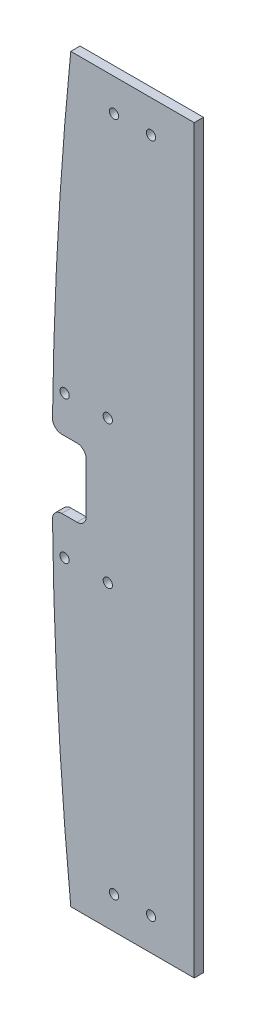
ISO-10303-21;
HEADER;
FILE_DESCRIPTION(('STEP AP214'),'2;1');
FILE_NAME('part.step','',(''),(''),'','','');
FILE_SCHEMA(('AUTOMOTIVE_DESIGN { 1 0 10303 214 1 1 1 1 }'));
ENDSEC;
DATA;
#1=APPLICATION_CONTEXT('core data for automotive mechanical design processes');
#2=APPLICATION_PROTOCOL_DEFINITION('international standard','automotive_design',2000,#1);
#3=PRODUCT_CONTEXT('',#1,'mechanical');
#4=PRODUCT('Part','Part','',(#3));
#5=PRODUCT_RELATED_PRODUCT_CATEGORY('part','',(#4));
#6=PRODUCT_DEFINITION_FORMATION('','',#4);
#7=PRODUCT_DEFINITION_CONTEXT('part definition',#1,'design');
#8=PRODUCT_DEFINITION('design','',#6,#7);
#9=PRODUCT_DEFINITION_SHAPE('','',#8);
#10=(LENGTH_UNIT() NAMED_UNIT(*) SI_UNIT(.MILLI.,.METRE.));
#11=(NAMED_UNIT(*) PLANE_ANGLE_UNIT() SI_UNIT($,.RADIAN.));
#12=(NAMED_UNIT(*) SI_UNIT($,.STERADIAN.) SOLID_ANGLE_UNIT());
#13=UNCERTAINTY_MEASURE_WITH_UNIT(LENGTH_MEASURE(1.E-05),#10,'distance_accuracy_value','');
#14=(GEOMETRIC_REPRESENTATION_CONTEXT(3) GLOBAL_UNCERTAINTY_ASSIGNED_CONTEXT((#13)) GLOBAL_UNIT_ASSIGNED_CONTEXT((#10,
#11,#12)) REPRESENTATION_CONTEXT('',''));
#15=CARTESIAN_POINT('',(0.,0.,0.));
#16=DIRECTION('',(0.,0.,1.));
#17=DIRECTION('',(1.,0.,0.));
#18=AXIS2_PLACEMENT_3D('',#15,#16,#17);
#19=CARTESIAN_POINT('',(3650.36632247804,1729.39124991335,3.));
#20=DIRECTION('',(0.,0.,1.));
#21=DIRECTION('',(1.,0.,0.));
#22=AXIS2_PLACEMENT_3D('',#19,#20,#21);
#23=PLANE('',#22);
#24=CARTESIAN_POINT('',(2451.36632247804,1706.29124991334,3.));
#25=DIRECTION('',(0.,0.,1.));
#26=DIRECTION('',(1.,0.,0.));
#27=AXIS2_PLACEMENT_3D('',#24,#25,#26);
#28=CIRCLE('',#27,1.50000000000006);
#29=CARTESIAN_POINT('',(2452.86632247804,1706.29124991334,3.));
#30=VERTEX_POINT('',#29);
#31=EDGE_CURVE('E307',#30,#30,#28,.T.);
#32=ORIENTED_EDGE('',*,*,#31,.F.);
#33=EDGE_LOOP('',(#32));
#34=FACE_BOUND('',#33,.T.);
#35=CARTESIAN_POINT('',(2465.36632247804,1752.49124991334,3.));
#36=DIRECTION('',(0.,0.,1.));
#37=DIRECTION('',(1.,0.,0.));
#38=AXIS2_PLACEMENT_3D('',#35,#36,#37);
#39=CIRCLE('',#38,1.50000000000006);
#40=CARTESIAN_POINT('',(2466.86632247804,1752.49124991334,3.));
#41=VERTEX_POINT('',#40);
#42=EDGE_CURVE('E319',#41,#41,#39,.T.);
#43=ORIENTED_EDGE('',*,*,#42,.F.);
#44=EDGE_LOOP('',(#43));
#45=FACE_BOUND('',#44,.T.);
#46=CARTESIAN_POINT('',(2467.36632247804,1838.89124991334,3.));
#47=DIRECTION('',(0.,0.,1.));
#48=DIRECTION('',(1.,0.,0.));
#49=AXIS2_PLACEMENT_3D('',#46,#47,#48);
#50=CIRCLE('',#49,1.50000000000006);
#51=CARTESIAN_POINT('',(2468.86632247804,1838.89124991334,3.));
#52=VERTEX_POINT('',#51);
#53=EDGE_CURVE('E331',#52,#52,#50,.T.);
#54=ORIENTED_EDGE('',*,*,#53,.F.);
#55=EDGE_LOOP('',(#54));
#56=FACE_BOUND('',#55,.T.);
#57=CARTESIAN_POINT('',(2479.36632247804,1619.89124991334,3.));
#58=DIRECTION('',(0.,0.,1.));
#59=DIRECTION('',(1.,0.,0.));
#60=AXIS2_PLACEMENT_3D('',#57,#58,#59);
#61=CIRCLE('',#60,1.50000000000006);
#62=CARTESIAN_POINT('',(2480.86632247804,1619.89124991334,3.));
#63=VERTEX_POINT('',#62);
#64=EDGE_CURVE('E157',#63,#63,#61,.T.);
#65=ORIENTED_EDGE('',*,*,#64,.F.);
#66=EDGE_LOOP('',(#65));
#67=FACE_BOUND('',#66,.T.);
#68=CARTESIAN_POINT('',(3650.36632247804,1729.39124991335,3.));
#69=DIRECTION('',(0.,0.,1.));
#70=DIRECTION('',(1.,0.,0.));
#71=AXIS2_PLACEMENT_3D('',#68,#69,#70);
#72=CIRCLE('',#71,1203.00000000001);
#73=CARTESIAN_POINT('',(2453.36632247804,1849.39124991338,3.));
#74=VERTEX_POINT('',#73);
#75=CARTESIAN_POINT('',(2447.44936993832,1743.52649991335,3.));
#76=VERTEX_POINT('',#75);
#77=EDGE_CURVE('E176',#74,#76,#72,.T.);
#78=ORIENTED_EDGE('',*,*,#77,.T.);
#79=CARTESIAN_POINT('',(2450.44916283742,1743.49124991334,3.));
#80=DIRECTION('',(0.,0.,1.));
#81=DIRECTION('',(1.,0.,0.));
#82=AXIS2_PLACEMENT_3D('',#79,#80,#81);
#83=CIRCLE('',#82,3.00000000000002);
#84=CARTESIAN_POINT('',(2450.44916283742,1740.49124991334,3.));
#85=VERTEX_POINT('',#84);
#86=EDGE_CURVE('E104',#76,#85,#83,.T.);
#87=ORIENTED_EDGE('',*,*,#86,.T.);
#88=DIRECTION('',(1.,0.,0.));
#89=VECTOR('',#88,1.);
#90=CARTESIAN_POINT('',(2455.36632247804,1740.49124991334,3.));
#91=LINE('',#90,#89);
#92=CARTESIAN_POINT('',(2455.36632247804,1740.49124991334,3.));
#93=VERTEX_POINT('',#92);
#94=EDGE_CURVE('E203',#85,#93,#91,.T.);
#95=ORIENTED_EDGE('',*,*,#94,.T.);
#96=CARTESIAN_POINT('',(2455.36632247804,1737.49124991334,3.));
#97=DIRECTION('',(0.,0.,-1.));
#98=DIRECTION('',(1.,0.,0.));
#99=AXIS2_PLACEMENT_3D('',#96,#97,#98);
#100=CIRCLE('',#99,2.99999999999978);
#101=CARTESIAN_POINT('',(2458.36632247804,1737.49124991334,3.));
#102=VERTEX_POINT('',#101);
#103=EDGE_CURVE('E222',#93,#102,#100,.T.);
#104=ORIENTED_EDGE('',*,*,#103,.T.);
#105=DIRECTION('',(0.,-1.,0.));
#106=VECTOR('',#105,1.);
#107=CARTESIAN_POINT('',(2458.36632247804,1721.29124991334,3.));
#108=LINE('',#107,#106);
#109=CARTESIAN_POINT('',(2458.36632247804,1721.29124991334,3.));
#110=VERTEX_POINT('',#109);
#111=EDGE_CURVE('E219',#102,#110,#108,.T.);
#112=ORIENTED_EDGE('',*,*,#111,.T.);
#113=CARTESIAN_POINT('',(2455.36632247804,1721.29124991334,3.));
#114=DIRECTION('',(0.,0.,-1.));
#115=DIRECTION('',(1.,0.,0.));
#116=AXIS2_PLACEMENT_3D('',#113,#114,#115);
#117=CIRCLE('',#116,2.99999999999989);
#118=CARTESIAN_POINT('',(2455.36632247804,1718.29124991334,3.));
#119=VERTEX_POINT('',#118);
#120=EDGE_CURVE('E221',#110,#119,#117,.T.);
#121=ORIENTED_EDGE('',*,*,#120,.T.);
#122=DIRECTION('',(-1.,0.,0.));
#123=VECTOR('',#122,1.);
#124=CARTESIAN_POINT('',(2455.36632247804,1718.29124991334,3.));
#125=LINE('',#124,#123);
#126=CARTESIAN_POINT('',(2450.44916283742,1718.29124991334,3.));
#127=VERTEX_POINT('',#126);
#128=EDGE_CURVE('E224',#119,#127,#125,.T.);
#129=ORIENTED_EDGE('',*,*,#128,.T.);
#130=CARTESIAN_POINT('',(2450.44916283742,1715.29124991334,3.));
#131=DIRECTION('',(0.,0.,1.));
#132=DIRECTION('',(1.,0.,0.));
#133=AXIS2_PLACEMENT_3D('',#130,#131,#132);
#134=CIRCLE('',#133,2.99999999999991);
#135=CARTESIAN_POINT('',(2447.44936993832,1715.25599991335,3.));
#136=VERTEX_POINT('',#135);
#137=EDGE_CURVE('E230',#127,#136,#134,.T.);
#138=ORIENTED_EDGE('',*,*,#137,.T.);
#139=CARTESIAN_POINT('',(3650.36632247804,1729.39124991335,3.));
#140=DIRECTION('',(0.,0.,1.));
#141=DIRECTION('',(1.,0.,0.));
#142=AXIS2_PLACEMENT_3D('',#139,#140,#141);
#143=CIRCLE('',#142,1203.00000000001);
#144=CARTESIAN_POINT('',(2453.36632247804,1609.39124991331,3.));
#145=VERTEX_POINT('',#144);
#146=EDGE_CURVE('E135',#136,#145,#143,.T.);
#147=ORIENTED_EDGE('',*,*,#146,.T.);
#148=DIRECTION('',(1.,7.88258347483922E-13,0.));
#149=VECTOR('',#148,1.);
#150=CARTESIAN_POINT('',(2453.36632247804,1609.39124991331,3.));
#151=LINE('',#150,#149);
#152=CARTESIAN_POINT('',(2493.36632247804,1609.39124991334,3.));
#153=VERTEX_POINT('',#152);
#154=EDGE_CURVE('E129',#145,#153,#151,.T.);
#155=ORIENTED_EDGE('',*,*,#154,.T.);
#156=DIRECTION('',(0.,1.,0.));
#157=VECTOR('',#156,1.);
#158=CARTESIAN_POINT('',(2493.36632247804,1849.39124991334,3.));
#159=LINE('',#158,#157);
#160=CARTESIAN_POINT('',(2493.36632247804,1849.39124991334,3.));
#161=VERTEX_POINT('',#160);
#162=EDGE_CURVE('E133',#153,#161,#159,.T.);
#163=ORIENTED_EDGE('',*,*,#162,.T.);
#164=DIRECTION('',(-1.,8.32667268468931E-13,0.));
#165=VECTOR('',#164,1.);
#166=CARTESIAN_POINT('',(2453.36632247804,1849.39124991338,3.));
#167=LINE('',#166,#165);
#168=EDGE_CURVE('E49',#161,#74,#167,.T.);
#169=ORIENTED_EDGE('',*,*,#168,.T.);
#170=EDGE_LOOP('',(#78,#87,#95,#104,#112,#121,#129,#138,#147,#155,#163,#169));
#171=FACE_BOUND('',#170,.T.);
#172=CARTESIAN_POINT('',(2467.36632247804,1619.89124991334,3.));
#173=DIRECTION('',(0.,0.,1.));
#174=DIRECTION('',(1.,0.,0.));
#175=AXIS2_PLACEMENT_3D('',#172,#173,#174);
#176=CIRCLE('',#175,1.50000000000006);
#177=CARTESIAN_POINT('',(2468.86632247804,1619.89124991334,3.));
#178=VERTEX_POINT('',#177);
#179=EDGE_CURVE('E337',#178,#178,#176,.T.);
#180=ORIENTED_EDGE('',*,*,#179,.F.);
#181=EDGE_LOOP('',(#180));
#182=FACE_BOUND('',#181,.T.);
#183=CARTESIAN_POINT('',(2479.36632247804,1838.89124991334,3.));
#184=DIRECTION('',(0.,0.,1.));
#185=DIRECTION('',(1.,0.,0.));
#186=AXIS2_PLACEMENT_3D('',#183,#184,#185);
#187=CIRCLE('',#186,1.50000000000006);
#188=CARTESIAN_POINT('',(2480.86632247804,1838.89124991334,3.));
#189=VERTEX_POINT('',#188);
#190=EDGE_CURVE('E325',#189,#189,#187,.T.);
#191=ORIENTED_EDGE('',*,*,#190,.F.);
#192=EDGE_LOOP('',(#191));
#193=FACE_BOUND('',#192,.T.);
#194=CARTESIAN_POINT('',(2465.36632247804,1706.29124991334,3.));
#195=DIRECTION('',(0.,0.,1.));
#196=DIRECTION('',(1.,0.,0.));
#197=AXIS2_PLACEMENT_3D('',#194,#195,#196);
#198=CIRCLE('',#197,1.50000000000006);
#199=CARTESIAN_POINT('',(2466.86632247804,1706.29124991334,3.));
#200=VERTEX_POINT('',#199);
#201=EDGE_CURVE('E313',#200,#200,#198,.T.);
#202=ORIENTED_EDGE('',*,*,#201,.F.);
#203=EDGE_LOOP('',(#202));
#204=FACE_BOUND('',#203,.T.);
#205=CARTESIAN_POINT('',(2451.36632247804,1752.49124991334,3.));
#206=DIRECTION('',(0.,0.,1.));
#207=DIRECTION('',(1.,0.,0.));
#208=AXIS2_PLACEMENT_3D('',#205,#206,#207);
#209=CIRCLE('',#208,1.50000000000006);
#210=CARTESIAN_POINT('',(2452.86632247804,1752.49124991334,3.));
#211=VERTEX_POINT('',#210);
#212=EDGE_CURVE('E298',#211,#211,#209,.T.);
#213=ORIENTED_EDGE('',*,*,#212,.F.);
#214=EDGE_LOOP('',(#213));
#215=FACE_BOUND('',#214,.T.);
#216=ADVANCED_FACE('F32',(#34,#45,#56,#67,#171,#182,#193,#204,#215),#23,.T.);
#217=CARTESIAN_POINT('',(3650.36632247804,1729.39124991335,0.));
#218=DIRECTION('',(0.,0.,1.));
#219=DIRECTION('',(1.,0.,0.));
#220=AXIS2_PLACEMENT_3D('',#217,#218,#219);
#221=PLANE('',#220);
#222=CARTESIAN_POINT('',(2451.36632247804,1706.29124991334,0.));
#223=DIRECTION('',(0.,0.,1.));
#224=DIRECTION('',(1.,0.,0.));
#225=AXIS2_PLACEMENT_3D('',#222,#223,#224);
#226=CIRCLE('',#225,1.50000000000006);
#227=CARTESIAN_POINT('',(2452.86632247804,1706.29124991334,0.));
#228=VERTEX_POINT('',#227);
#229=EDGE_CURVE('E304',#228,#228,#226,.T.);
#230=ORIENTED_EDGE('',*,*,#229,.T.);
#231=EDGE_LOOP('',(#230));
#232=FACE_BOUND('',#231,.T.);
#233=CARTESIAN_POINT('',(2465.36632247804,1752.49124991334,0.));
#234=DIRECTION('',(0.,0.,1.));
#235=DIRECTION('',(1.,0.,0.));
#236=AXIS2_PLACEMENT_3D('',#233,#234,#235);
#237=CIRCLE('',#236,1.50000000000006);
#238=CARTESIAN_POINT('',(2466.86632247804,1752.49124991334,0.));
#239=VERTEX_POINT('',#238);
#240=EDGE_CURVE('E316',#239,#239,#237,.T.);
#241=ORIENTED_EDGE('',*,*,#240,.T.);
#242=EDGE_LOOP('',(#241));
#243=FACE_BOUND('',#242,.T.);
#244=CARTESIAN_POINT('',(2467.36632247804,1838.89124991334,0.));
#245=DIRECTION('',(0.,0.,1.));
#246=DIRECTION('',(1.,0.,0.));
#247=AXIS2_PLACEMENT_3D('',#244,#245,#246);
#248=CIRCLE('',#247,1.50000000000006);
#249=CARTESIAN_POINT('',(2468.86632247804,1838.89124991334,0.));
#250=VERTEX_POINT('',#249);
#251=EDGE_CURVE('E328',#250,#250,#248,.T.);
#252=ORIENTED_EDGE('',*,*,#251,.T.);
#253=EDGE_LOOP('',(#252));
#254=FACE_BOUND('',#253,.T.);
#255=CARTESIAN_POINT('',(2479.36632247804,1619.89124991334,0.));
#256=DIRECTION('',(0.,0.,1.));
#257=DIRECTION('',(1.,0.,0.));
#258=AXIS2_PLACEMENT_3D('',#255,#256,#257);
#259=CIRCLE('',#258,1.50000000000006);
#260=CARTESIAN_POINT('',(2480.86632247804,1619.89124991334,0.));
#261=VERTEX_POINT('',#260);
#262=EDGE_CURVE('E340',#261,#261,#259,.T.);
#263=ORIENTED_EDGE('',*,*,#262,.T.);
#264=EDGE_LOOP('',(#263));
#265=FACE_BOUND('',#264,.T.);
#266=CARTESIAN_POINT('',(3650.36632247804,1729.39124991335,0.));
#267=DIRECTION('',(0.,0.,1.));
#268=DIRECTION('',(1.,0.,0.));
#269=AXIS2_PLACEMENT_3D('',#266,#267,#268);
#270=CIRCLE('',#269,1203.00000000001);
#271=CARTESIAN_POINT('',(2453.36632247804,1849.39124991338,0.));
#272=VERTEX_POINT('',#271);
#273=CARTESIAN_POINT('',(2447.44936993832,1743.52649991335,0.));
#274=VERTEX_POINT('',#273);
#275=EDGE_CURVE('E153',#272,#274,#270,.T.);
#276=ORIENTED_EDGE('',*,*,#275,.F.);
#277=DIRECTION('',(-1.,8.32667268468931E-13,0.));
#278=VECTOR('',#277,1.);
#279=CARTESIAN_POINT('',(2453.36632247804,1849.39124991338,0.));
#280=LINE('',#279,#278);
#281=CARTESIAN_POINT('',(2493.36632247804,1849.39124991334,0.));
#282=VERTEX_POINT('',#281);
#283=EDGE_CURVE('E96',#282,#272,#280,.T.);
#284=ORIENTED_EDGE('',*,*,#283,.F.);
#285=DIRECTION('',(0.,1.,0.));
#286=VECTOR('',#285,1.);
#287=CARTESIAN_POINT('',(2493.36632247804,1849.39124991334,0.));
#288=LINE('',#287,#286);
#289=CARTESIAN_POINT('',(2493.36632247804,1609.39124991334,0.));
#290=VERTEX_POINT('',#289);
#291=EDGE_CURVE('E90',#290,#282,#288,.T.);
#292=ORIENTED_EDGE('',*,*,#291,.F.);
#293=DIRECTION('',(1.,7.88258347483922E-13,0.));
#294=VECTOR('',#293,1.);
#295=CARTESIAN_POINT('',(2453.36632247804,1609.39124991331,0.));
#296=LINE('',#295,#294);
#297=CARTESIAN_POINT('',(2453.36632247804,1609.39124991331,0.));
#298=VERTEX_POINT('',#297);
#299=EDGE_CURVE('E143',#298,#290,#296,.T.);
#300=ORIENTED_EDGE('',*,*,#299,.F.);
#301=CARTESIAN_POINT('',(3650.36632247804,1729.39124991335,0.));
#302=DIRECTION('',(0.,0.,1.));
#303=DIRECTION('',(1.,0.,0.));
#304=AXIS2_PLACEMENT_3D('',#301,#302,#303);
#305=CIRCLE('',#304,1203.00000000001);
#306=CARTESIAN_POINT('',(2447.44936993832,1715.25599991335,0.));
#307=VERTEX_POINT('',#306);
#308=EDGE_CURVE('E171',#307,#298,#305,.T.);
#309=ORIENTED_EDGE('',*,*,#308,.F.);
#310=CARTESIAN_POINT('',(2450.44916283742,1715.29124991334,0.));
#311=DIRECTION('',(0.,0.,1.));
#312=DIRECTION('',(1.,0.,0.));
#313=AXIS2_PLACEMENT_3D('',#310,#311,#312);
#314=CIRCLE('',#313,2.99999999999991);
#315=CARTESIAN_POINT('',(2450.44916283742,1718.29124991334,0.));
#316=VERTEX_POINT('',#315);
#317=EDGE_CURVE('E169',#316,#307,#314,.T.);
#318=ORIENTED_EDGE('',*,*,#317,.F.);
#319=DIRECTION('',(-1.,0.,0.));
#320=VECTOR('',#319,1.);
#321=CARTESIAN_POINT('',(2455.36632247804,1718.29124991334,0.));
#322=LINE('',#321,#320);
#323=CARTESIAN_POINT('',(2455.36632247804,1718.29124991334,0.));
#324=VERTEX_POINT('',#323);
#325=EDGE_CURVE('E167',#324,#316,#322,.T.);
#326=ORIENTED_EDGE('',*,*,#325,.F.);
#327=CARTESIAN_POINT('',(2455.36632247804,1721.29124991334,0.));
#328=DIRECTION('',(0.,0.,-1.));
#329=DIRECTION('',(1.,0.,0.));
#330=AXIS2_PLACEMENT_3D('',#327,#328,#329);
#331=CIRCLE('',#330,2.99999999999989);
#332=CARTESIAN_POINT('',(2458.36632247804,1721.29124991334,0.));
#333=VERTEX_POINT('',#332);
#334=EDGE_CURVE('E165',#333,#324,#331,.T.);
#335=ORIENTED_EDGE('',*,*,#334,.F.);
#336=DIRECTION('',(0.,-1.,0.));
#337=VECTOR('',#336,1.);
#338=CARTESIAN_POINT('',(2458.36632247804,1721.29124991334,0.));
#339=LINE('',#338,#337);
#340=CARTESIAN_POINT('',(2458.36632247804,1737.49124991334,0.));
#341=VERTEX_POINT('',#340);
#342=EDGE_CURVE('E163',#341,#333,#339,.T.);
#343=ORIENTED_EDGE('',*,*,#342,.F.);
#344=CARTESIAN_POINT('',(2455.36632247804,1737.49124991334,0.));
#345=DIRECTION('',(0.,0.,-1.));
#346=DIRECTION('',(1.,0.,0.));
#347=AXIS2_PLACEMENT_3D('',#344,#345,#346);
#348=CIRCLE('',#347,2.99999999999978);
#349=CARTESIAN_POINT('',(2455.36632247804,1740.49124991334,0.));
#350=VERTEX_POINT('',#349);
#351=EDGE_CURVE('E161',#350,#341,#348,.T.);
#352=ORIENTED_EDGE('',*,*,#351,.F.);
#353=DIRECTION('',(1.,0.,0.));
#354=VECTOR('',#353,1.);
#355=CARTESIAN_POINT('',(2455.36632247804,1740.49124991334,0.));
#356=LINE('',#355,#354);
#357=CARTESIAN_POINT('',(2450.44916283742,1740.49124991334,0.));
#358=VERTEX_POINT('',#357);
#359=EDGE_CURVE('E159',#358,#350,#356,.T.);
#360=ORIENTED_EDGE('',*,*,#359,.F.);
#361=CARTESIAN_POINT('',(2450.44916283742,1743.49124991334,0.));
#362=DIRECTION('',(0.,0.,1.));
#363=DIRECTION('',(1.,0.,0.));
#364=AXIS2_PLACEMENT_3D('',#361,#362,#363);
#365=CIRCLE('',#364,3.00000000000002);
#366=EDGE_CURVE('E156',#274,#358,#365,.T.);
#367=ORIENTED_EDGE('',*,*,#366,.F.);
#368=EDGE_LOOP('',(#276,#284,#292,#300,#309,#318,#326,#335,#343,#352,#360,#367));
#369=FACE_BOUND('',#368,.T.);
#370=CARTESIAN_POINT('',(2467.36632247804,1619.89124991334,0.));
#371=DIRECTION('',(0.,0.,1.));
#372=DIRECTION('',(1.,0.,0.));
#373=AXIS2_PLACEMENT_3D('',#370,#371,#372);
#374=CIRCLE('',#373,1.50000000000006);
#375=CARTESIAN_POINT('',(2468.86632247804,1619.89124991334,0.));
#376=VERTEX_POINT('',#375);
#377=EDGE_CURVE('E334',#376,#376,#374,.T.);
#378=ORIENTED_EDGE('',*,*,#377,.T.);
#379=EDGE_LOOP('',(#378));
#380=FACE_BOUND('',#379,.T.);
#381=CARTESIAN_POINT('',(2479.36632247804,1838.89124991334,0.));
#382=DIRECTION('',(0.,0.,1.));
#383=DIRECTION('',(1.,0.,0.));
#384=AXIS2_PLACEMENT_3D('',#381,#382,#383);
#385=CIRCLE('',#384,1.50000000000006);
#386=CARTESIAN_POINT('',(2480.86632247804,1838.89124991334,0.));
#387=VERTEX_POINT('',#386);
#388=EDGE_CURVE('E322',#387,#387,#385,.T.);
#389=ORIENTED_EDGE('',*,*,#388,.T.);
#390=EDGE_LOOP('',(#389));
#391=FACE_BOUND('',#390,.T.);
#392=CARTESIAN_POINT('',(2465.36632247804,1706.29124991334,0.));
#393=DIRECTION('',(0.,0.,1.));
#394=DIRECTION('',(1.,0.,0.));
#395=AXIS2_PLACEMENT_3D('',#392,#393,#394);
#396=CIRCLE('',#395,1.50000000000006);
#397=CARTESIAN_POINT('',(2466.86632247804,1706.29124991334,0.));
#398=VERTEX_POINT('',#397);
#399=EDGE_CURVE('E310',#398,#398,#396,.T.);
#400=ORIENTED_EDGE('',*,*,#399,.T.);
#401=EDGE_LOOP('',(#400));
#402=FACE_BOUND('',#401,.T.);
#403=CARTESIAN_POINT('',(2451.36632247804,1752.49124991334,0.));
#404=DIRECTION('',(0.,0.,1.));
#405=DIRECTION('',(1.,0.,0.));
#406=AXIS2_PLACEMENT_3D('',#403,#404,#405);
#407=CIRCLE('',#406,1.50000000000006);
#408=CARTESIAN_POINT('',(2452.86632247804,1752.49124991334,0.));
#409=VERTEX_POINT('',#408);
#410=EDGE_CURVE('E301',#409,#409,#407,.T.);
#411=ORIENTED_EDGE('',*,*,#410,.T.);
#412=EDGE_LOOP('',(#411));
#413=FACE_BOUND('',#412,.T.);
#414=ADVANCED_FACE('F207',(#232,#243,#254,#265,#369,#380,#391,#402,#413),#221,.F.);
#415=CARTESIAN_POINT('',(3650.36632247804,1729.39124991335,3.));
#416=DIRECTION('',(0.,0.,-1.));
#417=DIRECTION('',(-1.,0.,0.));
#418=AXIS2_PLACEMENT_3D('',#415,#416,#417);
#419=CYLINDRICAL_SURFACE('',#418,1203.00000000001);
#420=ORIENTED_EDGE('',*,*,#275,.T.);
#421=DIRECTION('',(0.,0.,-1.));
#422=VECTOR('',#421,1.);
#423=CARTESIAN_POINT('',(2447.44936993832,1743.52649991335,3.));
#424=LINE('',#423,#422);
#425=EDGE_CURVE('E11',#76,#274,#424,.T.);
#426=ORIENTED_EDGE('',*,*,#425,.F.);
#427=ORIENTED_EDGE('',*,*,#77,.F.);
#428=DIRECTION('',(0.,0.,-1.));
#429=VECTOR('',#428,1.);
#430=CARTESIAN_POINT('',(2453.36632247804,1849.39124991338,3.));
#431=LINE('',#430,#429);
#432=EDGE_CURVE('E149',#74,#272,#431,.T.);
#433=ORIENTED_EDGE('',*,*,#432,.T.);
#434=EDGE_LOOP('',(#420,#426,#427,#433));
#435=FACE_BOUND('',#434,.T.);
#436=ADVANCED_FACE('F34',(#435),#419,.T.);
#437=CARTESIAN_POINT('',(2450.44916283742,1743.49124991334,3.));
#438=DIRECTION('',(0.,0.,-1.));
#439=DIRECTION('',(-1.,0.,0.));
#440=AXIS2_PLACEMENT_3D('',#437,#438,#439);
#441=CYLINDRICAL_SURFACE('',#440,3.00000000000002);
#442=ORIENTED_EDGE('',*,*,#366,.T.);
#443=DIRECTION('',(0.,0.,-1.));
#444=VECTOR('',#443,1.);
#445=CARTESIAN_POINT('',(2450.44916283742,1740.49124991334,3.));
#446=LINE('',#445,#444);
#447=EDGE_CURVE('E41',#85,#358,#446,.T.);
#448=ORIENTED_EDGE('',*,*,#447,.F.);
#449=ORIENTED_EDGE('',*,*,#86,.F.);
#450=ORIENTED_EDGE('',*,*,#425,.T.);
#451=EDGE_LOOP('',(#442,#448,#449,#450));
#452=FACE_BOUND('',#451,.T.);
#453=ADVANCED_FACE('F485',(#452),#441,.T.);
#454=CARTESIAN_POINT('',(2455.36632247804,1740.49124991334,3.));
#455=DIRECTION('',(0.,1.,0.));
#456=DIRECTION('',(0.,0.,1.));
#457=AXIS2_PLACEMENT_3D('',#454,#455,#456);
#458=PLANE('',#457);
#459=ORIENTED_EDGE('',*,*,#359,.T.);
#460=DIRECTION('',(0.,0.,-1.));
#461=VECTOR('',#460,1.);
#462=CARTESIAN_POINT('',(2455.36632247804,1740.49124991334,3.));
#463=LINE('',#462,#461);
#464=EDGE_CURVE('E195',#93,#350,#463,.T.);
#465=ORIENTED_EDGE('',*,*,#464,.F.);
#466=ORIENTED_EDGE('',*,*,#94,.F.);
#467=ORIENTED_EDGE('',*,*,#447,.T.);
#468=EDGE_LOOP('',(#459,#465,#466,#467));
#469=FACE_BOUND('',#468,.T.);
#470=ADVANCED_FACE('F201',(#469),#458,.F.);
#471=CARTESIAN_POINT('',(2455.36632247804,1737.49124991334,3.));
#472=DIRECTION('',(0.,0.,-1.));
#473=DIRECTION('',(-1.,0.,0.));
#474=AXIS2_PLACEMENT_3D('',#471,#472,#473);
#475=CYLINDRICAL_SURFACE('',#474,2.99999999999978);
#476=ORIENTED_EDGE('',*,*,#351,.T.);
#477=DIRECTION('',(0.,0.,-1.));
#478=VECTOR('',#477,1.);
#479=CARTESIAN_POINT('',(2458.36632247804,1737.49124991334,3.));
#480=LINE('',#479,#478);
#481=EDGE_CURVE('E192',#102,#341,#480,.T.);
#482=ORIENTED_EDGE('',*,*,#481,.F.);
#483=ORIENTED_EDGE('',*,*,#103,.F.);
#484=ORIENTED_EDGE('',*,*,#464,.T.);
#485=EDGE_LOOP('',(#476,#482,#483,#484));
#486=FACE_BOUND('',#485,.T.);
#487=ADVANCED_FACE('F213',(#486),#475,.F.);
#488=CARTESIAN_POINT('',(2458.36632247804,1721.29124991334,3.));
#489=DIRECTION('',(1.,0.,0.));
#490=DIRECTION('',(0.,0.,-1.));
#491=AXIS2_PLACEMENT_3D('',#488,#489,#490);
#492=PLANE('',#491);
#493=ORIENTED_EDGE('',*,*,#342,.T.);
#494=DIRECTION('',(0.,0.,-1.));
#495=VECTOR('',#494,1.);
#496=CARTESIAN_POINT('',(2458.36632247804,1721.29124991334,3.));
#497=LINE('',#496,#495);
#498=EDGE_CURVE('E189',#110,#333,#497,.T.);
#499=ORIENTED_EDGE('',*,*,#498,.F.);
#500=ORIENTED_EDGE('',*,*,#111,.F.);
#501=ORIENTED_EDGE('',*,*,#481,.T.);
#502=EDGE_LOOP('',(#493,#499,#500,#501));
#503=FACE_BOUND('',#502,.T.);
#504=ADVANCED_FACE('F217',(#503),#492,.F.);
#505=CARTESIAN_POINT('',(2455.36632247804,1721.29124991334,3.));
#506=DIRECTION('',(0.,0.,-1.));
#507=DIRECTION('',(-1.,0.,0.));
#508=AXIS2_PLACEMENT_3D('',#505,#506,#507);
#509=CYLINDRICAL_SURFACE('',#508,2.99999999999989);
#510=ORIENTED_EDGE('',*,*,#334,.T.);
#511=DIRECTION('',(0.,0.,-1.));
#512=VECTOR('',#511,1.);
#513=CARTESIAN_POINT('',(2455.36632247804,1718.29124991334,3.));
#514=LINE('',#513,#512);
#515=EDGE_CURVE('E186',#119,#324,#514,.T.);
#516=ORIENTED_EDGE('',*,*,#515,.F.);
#517=ORIENTED_EDGE('',*,*,#120,.F.);
#518=ORIENTED_EDGE('',*,*,#498,.T.);
#519=EDGE_LOOP('',(#510,#516,#517,#518));
#520=FACE_BOUND('',#519,.T.);
#521=ADVANCED_FACE('F450',(#520),#509,.F.);
#522=CARTESIAN_POINT('',(2455.36632247804,1718.29124991334,3.));
#523=DIRECTION('',(0.,-1.,0.));
#524=DIRECTION('',(0.,0.,-1.));
#525=AXIS2_PLACEMENT_3D('',#522,#523,#524);
#526=PLANE('',#525);
#527=ORIENTED_EDGE('',*,*,#325,.T.);
#528=DIRECTION('',(0.,0.,-1.));
#529=VECTOR('',#528,1.);
#530=CARTESIAN_POINT('',(2450.44916283742,1718.29124991334,3.));
#531=LINE('',#530,#529);
#532=EDGE_CURVE('E183',#127,#316,#531,.T.);
#533=ORIENTED_EDGE('',*,*,#532,.F.);
#534=ORIENTED_EDGE('',*,*,#128,.F.);
#535=ORIENTED_EDGE('',*,*,#515,.T.);
#536=EDGE_LOOP('',(#527,#533,#534,#535));
#537=FACE_BOUND('',#536,.T.);
#538=ADVANCED_FACE('F441',(#537),#526,.F.);
#539=CARTESIAN_POINT('',(2450.44916283742,1715.29124991334,3.));
#540=DIRECTION('',(0.,0.,-1.));
#541=DIRECTION('',(-1.,0.,0.));
#542=AXIS2_PLACEMENT_3D('',#539,#540,#541);
#543=CYLINDRICAL_SURFACE('',#542,2.99999999999991);
#544=ORIENTED_EDGE('',*,*,#317,.T.);
#545=DIRECTION('',(0.,0.,-1.));
#546=VECTOR('',#545,1.);
#547=CARTESIAN_POINT('',(2447.44936993832,1715.25599991335,3.));
#548=LINE('',#547,#546);
#549=EDGE_CURVE('E180',#136,#307,#548,.T.);
#550=ORIENTED_EDGE('',*,*,#549,.F.);
#551=ORIENTED_EDGE('',*,*,#137,.F.);
#552=ORIENTED_EDGE('',*,*,#532,.T.);
#553=EDGE_LOOP('',(#544,#550,#551,#552));
#554=FACE_BOUND('',#553,.T.);
#555=ADVANCED_FACE('F236',(#554),#543,.T.);
#556=CARTESIAN_POINT('',(3650.36632247804,1729.39124991335,3.));
#557=DIRECTION('',(0.,0.,-1.));
#558=DIRECTION('',(-1.,0.,0.));
#559=AXIS2_PLACEMENT_3D('',#556,#557,#558);
#560=CYLINDRICAL_SURFACE('',#559,1203.00000000001);
#561=ORIENTED_EDGE('',*,*,#308,.T.);
#562=DIRECTION('',(0.,0.,-1.));
#563=VECTOR('',#562,1.);
#564=CARTESIAN_POINT('',(2453.36632247804,1609.39124991331,3.));
#565=LINE('',#564,#563);
#566=EDGE_CURVE('E144',#145,#298,#565,.T.);
#567=ORIENTED_EDGE('',*,*,#566,.F.);
#568=ORIENTED_EDGE('',*,*,#146,.F.);
#569=ORIENTED_EDGE('',*,*,#549,.T.);
#570=EDGE_LOOP('',(#561,#567,#568,#569));
#571=FACE_BOUND('',#570,.T.);
#572=ADVANCED_FACE('F240',(#571),#560,.T.);
#573=CARTESIAN_POINT('',(2453.36632247804,1609.39124991331,3.));
#574=DIRECTION('',(-7.88258347483922E-13,1.,0.));
#575=DIRECTION('',(-1.,-7.88258347483922E-13,0.));
#576=AXIS2_PLACEMENT_3D('',#573,#574,#575);
#577=PLANE('',#576);
#578=ORIENTED_EDGE('',*,*,#299,.T.);
#579=DIRECTION('',(0.,0.,-1.));
#580=VECTOR('',#579,1.);
#581=CARTESIAN_POINT('',(2493.36632247804,1609.39124991334,3.));
#582=LINE('',#581,#580);
#583=EDGE_CURVE('E140',#153,#290,#582,.T.);
#584=ORIENTED_EDGE('',*,*,#583,.F.);
#585=ORIENTED_EDGE('',*,*,#154,.F.);
#586=ORIENTED_EDGE('',*,*,#566,.T.);
#587=EDGE_LOOP('',(#578,#584,#585,#586));
#588=FACE_BOUND('',#587,.T.);
#589=ADVANCED_FACE('F141',(#588),#577,.F.);
#590=CARTESIAN_POINT('',(2493.36632247804,1849.39124991334,3.));
#591=DIRECTION('',(-1.,0.,0.));
#592=DIRECTION('',(0.,0.,1.));
#593=AXIS2_PLACEMENT_3D('',#590,#591,#592);
#594=PLANE('',#593);
#595=ORIENTED_EDGE('',*,*,#291,.T.);
#596=DIRECTION('',(0.,0.,-1.));
#597=VECTOR('',#596,1.);
#598=CARTESIAN_POINT('',(2493.36632247804,1849.39124991334,3.));
#599=LINE('',#598,#597);
#600=EDGE_CURVE('E145',#161,#282,#599,.T.);
#601=ORIENTED_EDGE('',*,*,#600,.F.);
#602=ORIENTED_EDGE('',*,*,#162,.F.);
#603=ORIENTED_EDGE('',*,*,#583,.T.);
#604=EDGE_LOOP('',(#595,#601,#602,#603));
#605=FACE_BOUND('',#604,.T.);
#606=ADVANCED_FACE('F147',(#605),#594,.F.);
#607=CARTESIAN_POINT('',(2453.36632247804,1849.39124991338,3.));
#608=DIRECTION('',(-8.32667268468931E-13,-1.,0.));
#609=DIRECTION('',(1.,-8.32667268468931E-13,0.));
#610=AXIS2_PLACEMENT_3D('',#607,#608,#609);
#611=PLANE('',#610);
#612=ORIENTED_EDGE('',*,*,#283,.T.);
#613=ORIENTED_EDGE('',*,*,#432,.F.);
#614=ORIENTED_EDGE('',*,*,#168,.F.);
#615=ORIENTED_EDGE('',*,*,#600,.T.);
#616=EDGE_LOOP('',(#612,#613,#614,#615));
#617=FACE_BOUND('',#616,.T.);
#618=ADVANCED_FACE('F244',(#617),#611,.F.);
#619=CARTESIAN_POINT('',(2479.36632247804,1619.89124991334,3.));
#620=DIRECTION('',(0.,0.,-1.));
#621=DIRECTION('',(-1.,0.,0.));
#622=AXIS2_PLACEMENT_3D('',#619,#620,#621);
#623=CYLINDRICAL_SURFACE('',#622,1.50000000000006);
#624=ORIENTED_EDGE('',*,*,#64,.T.);
#625=EDGE_LOOP('',(#624));
#626=FACE_BOUND('',#625,.T.);
#627=ORIENTED_EDGE('',*,*,#262,.F.);
#628=EDGE_LOOP('',(#627));
#629=FACE_BOUND('',#628,.T.);
#630=ADVANCED_FACE('F246',(#626,#629),#623,.F.);
#631=CARTESIAN_POINT('',(2467.36632247804,1619.89124991334,3.));
#632=DIRECTION('',(0.,0.,-1.));
#633=DIRECTION('',(-1.,0.,0.));
#634=AXIS2_PLACEMENT_3D('',#631,#632,#633);
#635=CYLINDRICAL_SURFACE('',#634,1.50000000000006);
#636=ORIENTED_EDGE('',*,*,#179,.T.);
#637=EDGE_LOOP('',(#636));
#638=FACE_BOUND('',#637,.T.);
#639=ORIENTED_EDGE('',*,*,#377,.F.);
#640=EDGE_LOOP('',(#639));
#641=FACE_BOUND('',#640,.T.);
#642=ADVANCED_FACE('F252',(#638,#641),#635,.F.);
#643=CARTESIAN_POINT('',(2467.36632247804,1838.89124991334,3.));
#644=DIRECTION('',(0.,0.,-1.));
#645=DIRECTION('',(-1.,0.,0.));
#646=AXIS2_PLACEMENT_3D('',#643,#644,#645);
#647=CYLINDRICAL_SURFACE('',#646,1.50000000000006);
#648=ORIENTED_EDGE('',*,*,#53,.T.);
#649=EDGE_LOOP('',(#648));
#650=FACE_BOUND('',#649,.T.);
#651=ORIENTED_EDGE('',*,*,#251,.F.);
#652=EDGE_LOOP('',(#651));
#653=FACE_BOUND('',#652,.T.);
#654=ADVANCED_FACE('F269',(#650,#653),#647,.F.);
#655=CARTESIAN_POINT('',(2479.36632247804,1838.89124991334,3.));
#656=DIRECTION('',(0.,0.,-1.));
#657=DIRECTION('',(-1.,0.,0.));
#658=AXIS2_PLACEMENT_3D('',#655,#656,#657);
#659=CYLINDRICAL_SURFACE('',#658,1.50000000000006);
#660=ORIENTED_EDGE('',*,*,#190,.T.);
#661=EDGE_LOOP('',(#660));
#662=FACE_BOUND('',#661,.T.);
#663=ORIENTED_EDGE('',*,*,#388,.F.);
#664=EDGE_LOOP('',(#663));
#665=FACE_BOUND('',#664,.T.);
#666=ADVANCED_FACE('F273',(#662,#665),#659,.F.);
#667=CARTESIAN_POINT('',(2465.36632247804,1752.49124991334,3.));
#668=DIRECTION('',(0.,0.,-1.));
#669=DIRECTION('',(-1.,0.,0.));
#670=AXIS2_PLACEMENT_3D('',#667,#668,#669);
#671=CYLINDRICAL_SURFACE('',#670,1.50000000000006);
#672=ORIENTED_EDGE('',*,*,#42,.T.);
#673=EDGE_LOOP('',(#672));
#674=FACE_BOUND('',#673,.T.);
#675=ORIENTED_EDGE('',*,*,#240,.F.);
#676=EDGE_LOOP('',(#675));
#677=FACE_BOUND('',#676,.T.);
#678=ADVANCED_FACE('F277',(#674,#677),#671,.F.);
#679=CARTESIAN_POINT('',(2465.36632247804,1706.29124991334,3.));
#680=DIRECTION('',(0.,0.,-1.));
#681=DIRECTION('',(-1.,0.,0.));
#682=AXIS2_PLACEMENT_3D('',#679,#680,#681);
#683=CYLINDRICAL_SURFACE('',#682,1.50000000000006);
#684=ORIENTED_EDGE('',*,*,#201,.T.);
#685=EDGE_LOOP('',(#684));
#686=FACE_BOUND('',#685,.T.);
#687=ORIENTED_EDGE('',*,*,#399,.F.);
#688=EDGE_LOOP('',(#687));
#689=FACE_BOUND('',#688,.T.);
#690=ADVANCED_FACE('F281',(#686,#689),#683,.F.);
#691=CARTESIAN_POINT('',(2451.36632247804,1706.29124991334,3.));
#692=DIRECTION('',(0.,0.,-1.));
#693=DIRECTION('',(-1.,0.,0.));
#694=AXIS2_PLACEMENT_3D('',#691,#692,#693);
#695=CYLINDRICAL_SURFACE('',#694,1.50000000000006);
#696=ORIENTED_EDGE('',*,*,#31,.T.);
#697=EDGE_LOOP('',(#696));
#698=FACE_BOUND('',#697,.T.);
#699=ORIENTED_EDGE('',*,*,#229,.F.);
#700=EDGE_LOOP('',(#699));
#701=FACE_BOUND('',#700,.T.);
#702=ADVANCED_FACE('F285',(#698,#701),#695,.F.);
#703=CARTESIAN_POINT('',(2451.36632247804,1752.49124991334,3.));
#704=DIRECTION('',(0.,0.,-1.));
#705=DIRECTION('',(-1.,0.,0.));
#706=AXIS2_PLACEMENT_3D('',#703,#704,#705);
#707=CYLINDRICAL_SURFACE('',#706,1.50000000000006);
#708=ORIENTED_EDGE('',*,*,#212,.T.);
#709=EDGE_LOOP('',(#708));
#710=FACE_BOUND('',#709,.T.);
#711=ORIENTED_EDGE('',*,*,#410,.F.);
#712=EDGE_LOOP('',(#711));
#713=FACE_BOUND('',#712,.T.);
#714=ADVANCED_FACE('F289',(#710,#713),#707,.F.);
#715=CLOSED_SHELL('',(#216,#414,#436,#453,#470,#487,#504,#521,#538,#555,#572,#589,#606,#618,
#630,#642,#654,#666,#678,#690,#702,#714));
#716=MANIFOLD_SOLID_BREP('B2',#715);
#717=ADVANCED_BREP_SHAPE_REPRESENTATION('',(#18,#716),#14);
#718=SHAPE_DEFINITION_REPRESENTATION(#9,#717);
ENDSEC;
END-ISO-10303-21;
